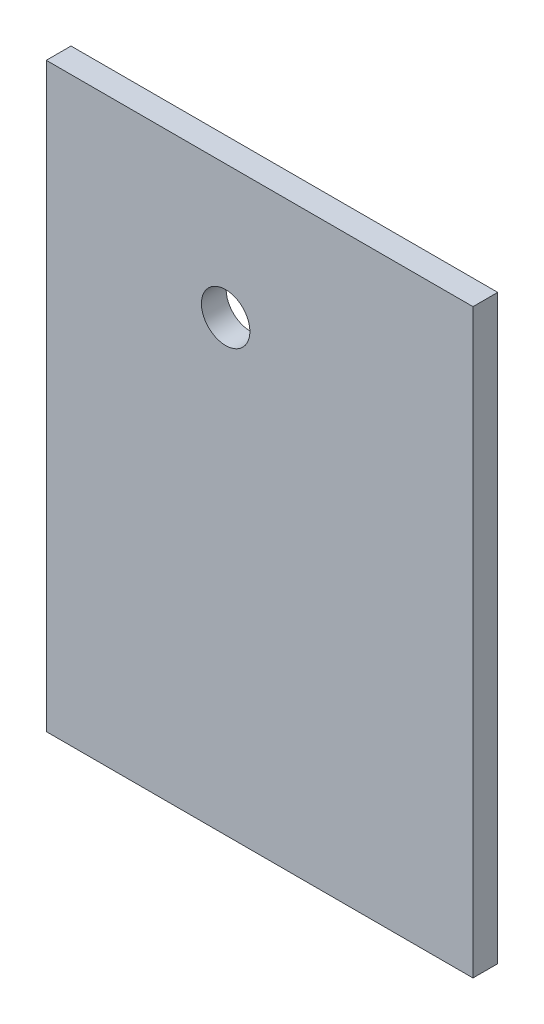
ISO-10303-21;
HEADER;
FILE_DESCRIPTION(('STEP AP214'),'2;1');
FILE_NAME('part.step','',(''),(''),'','','');
FILE_SCHEMA(('AUTOMOTIVE_DESIGN { 1 0 10303 214 1 1 1 1 }'));
ENDSEC;
DATA;
#1=APPLICATION_CONTEXT('core data for automotive mechanical design processes');
#2=APPLICATION_PROTOCOL_DEFINITION('international standard','automotive_design',2000,#1);
#3=PRODUCT_CONTEXT('',#1,'mechanical');
#4=PRODUCT('Part','Part','',(#3));
#5=PRODUCT_RELATED_PRODUCT_CATEGORY('part','',(#4));
#6=PRODUCT_DEFINITION_FORMATION('','',#4);
#7=PRODUCT_DEFINITION_CONTEXT('part definition',#1,'design');
#8=PRODUCT_DEFINITION('design','',#6,#7);
#9=PRODUCT_DEFINITION_SHAPE('','',#8);
#10=(LENGTH_UNIT() NAMED_UNIT(*) SI_UNIT(.MILLI.,.METRE.));
#11=(NAMED_UNIT(*) PLANE_ANGLE_UNIT() SI_UNIT($,.RADIAN.));
#12=(NAMED_UNIT(*) SI_UNIT($,.STERADIAN.) SOLID_ANGLE_UNIT());
#13=UNCERTAINTY_MEASURE_WITH_UNIT(LENGTH_MEASURE(1.E-05),#10,'distance_accuracy_value','');
#14=(GEOMETRIC_REPRESENTATION_CONTEXT(3) GLOBAL_UNCERTAINTY_ASSIGNED_CONTEXT((#13)) GLOBAL_UNIT_ASSIGNED_CONTEXT((#10,
#11,#12)) REPRESENTATION_CONTEXT('',''));
#15=CARTESIAN_POINT('',(0.,0.,0.));
#16=DIRECTION('',(0.,0.,1.));
#17=DIRECTION('',(1.,0.,0.));
#18=AXIS2_PLACEMENT_3D('',#15,#16,#17);
#19=CARTESIAN_POINT('',(0.,0.,2.54));
#20=DIRECTION('',(0.,0.,-1.));
#21=DIRECTION('',(-1.,0.,0.));
#22=AXIS2_PLACEMENT_3D('',#19,#20,#21);
#23=PLANE('',#22);
#24=DIRECTION('',(0.,-1.,0.));
#25=VECTOR('',#24,1.);
#26=CARTESIAN_POINT('',(95.8806209550243,98.4885,2.54));
#27=LINE('',#26,#25);
#28=CARTESIAN_POINT('',(95.8806209550243,158.196337730134,2.54));
#29=VERTEX_POINT('',#28);
#30=CARTESIAN_POINT('',(95.8806209550243,98.4885,2.54));
#31=VERTEX_POINT('',#30);
#32=EDGE_CURVE('E95',#29,#31,#27,.T.);
#33=ORIENTED_EDGE('',*,*,#32,.T.);
#34=DIRECTION('',(1.,0.,0.));
#35=VECTOR('',#34,1.);
#36=CARTESIAN_POINT('',(95.8806209550243,98.4885,2.54));
#37=LINE('',#36,#35);
#38=CARTESIAN_POINT('',(139.7,98.4885,2.54));
#39=VERTEX_POINT('',#38);
#40=EDGE_CURVE('E90',#31,#39,#37,.T.);
#41=ORIENTED_EDGE('',*,*,#40,.T.);
#42=DIRECTION('',(0.,1.,0.));
#43=VECTOR('',#42,1.);
#44=CARTESIAN_POINT('',(139.7,98.4885,2.54));
#45=LINE('',#44,#43);
#46=CARTESIAN_POINT('',(139.7,158.196337730134,2.54));
#47=VERTEX_POINT('',#46);
#48=EDGE_CURVE('E93',#39,#47,#45,.T.);
#49=ORIENTED_EDGE('',*,*,#48,.T.);
#50=DIRECTION('',(-1.,0.,0.));
#51=VECTOR('',#50,1.);
#52=CARTESIAN_POINT('',(95.8806209550243,158.196337730134,2.54));
#53=LINE('',#52,#51);
#54=EDGE_CURVE('E60',#47,#29,#53,.T.);
#55=ORIENTED_EDGE('',*,*,#54,.T.);
#56=EDGE_LOOP('',(#33,#41,#49,#55));
#57=FACE_BOUND('',#56,.T.);
#58=CARTESIAN_POINT('',(114.3,144.526,2.54));
#59=DIRECTION('',(0.,0.,1.));
#60=DIRECTION('',(1.,0.,0.));
#61=AXIS2_PLACEMENT_3D('',#58,#59,#60);
#62=CIRCLE('',#61,2.48920000000003);
#63=CARTESIAN_POINT('',(116.7892,144.526,2.54));
#64=VERTEX_POINT('',#63);
#65=EDGE_CURVE('E110',#64,#64,#62,.T.);
#66=ORIENTED_EDGE('',*,*,#65,.F.);
#67=EDGE_LOOP('',(#66));
#68=FACE_BOUND('',#67,.T.);
#69=ADVANCED_FACE('F43',(#57,#68),#23,.F.);
#70=CARTESIAN_POINT('',(0.,0.,0.));
#71=DIRECTION('',(0.,0.,-1.));
#72=DIRECTION('',(-1.,0.,0.));
#73=AXIS2_PLACEMENT_3D('',#70,#71,#72);
#74=PLANE('',#73);
#75=DIRECTION('',(0.,-1.,0.));
#76=VECTOR('',#75,1.);
#77=CARTESIAN_POINT('',(95.8806209550243,98.4885,0.));
#78=LINE('',#77,#76);
#79=CARTESIAN_POINT('',(95.8806209550243,158.196337730134,0.));
#80=VERTEX_POINT('',#79);
#81=CARTESIAN_POINT('',(95.8806209550243,98.4885,0.));
#82=VERTEX_POINT('',#81);
#83=EDGE_CURVE('E107',#80,#82,#78,.T.);
#84=ORIENTED_EDGE('',*,*,#83,.F.);
#85=DIRECTION('',(-1.,0.,0.));
#86=VECTOR('',#85,1.);
#87=CARTESIAN_POINT('',(95.8806209550243,158.196337730134,0.));
#88=LINE('',#87,#86);
#89=CARTESIAN_POINT('',(139.7,158.196337730134,0.));
#90=VERTEX_POINT('',#89);
#91=EDGE_CURVE('E83',#90,#80,#88,.T.);
#92=ORIENTED_EDGE('',*,*,#91,.F.);
#93=DIRECTION('',(0.,1.,0.));
#94=VECTOR('',#93,1.);
#95=CARTESIAN_POINT('',(139.7,98.4885,0.));
#96=LINE('',#95,#94);
#97=CARTESIAN_POINT('',(139.7,98.4885,0.));
#98=VERTEX_POINT('',#97);
#99=EDGE_CURVE('E77',#98,#90,#96,.T.);
#100=ORIENTED_EDGE('',*,*,#99,.F.);
#101=DIRECTION('',(1.,0.,0.));
#102=VECTOR('',#101,1.);
#103=CARTESIAN_POINT('',(95.8806209550243,98.4885,0.));
#104=LINE('',#103,#102);
#105=EDGE_CURVE('E99',#82,#98,#104,.T.);
#106=ORIENTED_EDGE('',*,*,#105,.F.);
#107=EDGE_LOOP('',(#84,#92,#100,#106));
#108=FACE_BOUND('',#107,.T.);
#109=CARTESIAN_POINT('',(114.3,144.526,0.));
#110=DIRECTION('',(0.,0.,1.));
#111=DIRECTION('',(1.,0.,0.));
#112=AXIS2_PLACEMENT_3D('',#109,#110,#111);
#113=CIRCLE('',#112,2.48920000000003);
#114=CARTESIAN_POINT('',(116.7892,144.526,0.));
#115=VERTEX_POINT('',#114);
#116=EDGE_CURVE('E122',#115,#115,#113,.T.);
#117=ORIENTED_EDGE('',*,*,#116,.T.);
#118=EDGE_LOOP('',(#117));
#119=FACE_BOUND('',#118,.T.);
#120=ADVANCED_FACE('F118',(#108,#119),#74,.T.);
#121=CARTESIAN_POINT('',(95.8806209550243,98.4885,2.54));
#122=DIRECTION('',(1.,0.,0.));
#123=DIRECTION('',(0.,0.,-1.));
#124=AXIS2_PLACEMENT_3D('',#121,#122,#123);
#125=PLANE('',#124);
#126=ORIENTED_EDGE('',*,*,#83,.T.);
#127=DIRECTION('',(0.,0.,-1.));
#128=VECTOR('',#127,1.);
#129=CARTESIAN_POINT('',(95.8806209550243,98.4885,2.54));
#130=LINE('',#129,#128);
#131=EDGE_CURVE('E11',#31,#82,#130,.T.);
#132=ORIENTED_EDGE('',*,*,#131,.F.);
#133=ORIENTED_EDGE('',*,*,#32,.F.);
#134=DIRECTION('',(0.,0.,-1.));
#135=VECTOR('',#134,1.);
#136=CARTESIAN_POINT('',(95.8806209550243,158.196337730134,2.54));
#137=LINE('',#136,#135);
#138=EDGE_CURVE('E103',#29,#80,#137,.T.);
#139=ORIENTED_EDGE('',*,*,#138,.T.);
#140=EDGE_LOOP('',(#126,#132,#133,#139));
#141=FACE_BOUND('',#140,.T.);
#142=ADVANCED_FACE('F45',(#141),#125,.F.);
#143=CARTESIAN_POINT('',(95.8806209550243,98.4885,2.54));
#144=DIRECTION('',(0.,1.,0.));
#145=DIRECTION('',(0.,0.,1.));
#146=AXIS2_PLACEMENT_3D('',#143,#144,#145);
#147=PLANE('',#146);
#148=ORIENTED_EDGE('',*,*,#105,.T.);
#149=DIRECTION('',(0.,0.,-1.));
#150=VECTOR('',#149,1.);
#151=CARTESIAN_POINT('',(139.7,98.4885,2.54));
#152=LINE('',#151,#150);
#153=EDGE_CURVE('E52',#39,#98,#152,.T.);
#154=ORIENTED_EDGE('',*,*,#153,.F.);
#155=ORIENTED_EDGE('',*,*,#40,.F.);
#156=ORIENTED_EDGE('',*,*,#131,.T.);
#157=EDGE_LOOP('',(#148,#154,#155,#156));
#158=FACE_BOUND('',#157,.T.);
#159=ADVANCED_FACE('F98',(#158),#147,.F.);
#160=CARTESIAN_POINT('',(139.7,98.4885,2.54));
#161=DIRECTION('',(-1.,0.,0.));
#162=DIRECTION('',(0.,0.,1.));
#163=AXIS2_PLACEMENT_3D('',#160,#161,#162);
#164=PLANE('',#163);
#165=ORIENTED_EDGE('',*,*,#99,.T.);
#166=DIRECTION('',(0.,0.,-1.));
#167=VECTOR('',#166,1.);
#168=CARTESIAN_POINT('',(139.7,158.196337730134,2.54));
#169=LINE('',#168,#167);
#170=EDGE_CURVE('E100',#47,#90,#169,.T.);
#171=ORIENTED_EDGE('',*,*,#170,.F.);
#172=ORIENTED_EDGE('',*,*,#48,.F.);
#173=ORIENTED_EDGE('',*,*,#153,.T.);
#174=EDGE_LOOP('',(#165,#171,#172,#173));
#175=FACE_BOUND('',#174,.T.);
#176=ADVANCED_FACE('F101',(#175),#164,.F.);
#177=CARTESIAN_POINT('',(95.8806209550243,158.196337730134,2.54));
#178=DIRECTION('',(0.,-1.,0.));
#179=DIRECTION('',(0.,0.,-1.));
#180=AXIS2_PLACEMENT_3D('',#177,#178,#179);
#181=PLANE('',#180);
#182=ORIENTED_EDGE('',*,*,#91,.T.);
#183=ORIENTED_EDGE('',*,*,#138,.F.);
#184=ORIENTED_EDGE('',*,*,#54,.F.);
#185=ORIENTED_EDGE('',*,*,#170,.T.);
#186=EDGE_LOOP('',(#182,#183,#184,#185));
#187=FACE_BOUND('',#186,.T.);
#188=ADVANCED_FACE('F115',(#187),#181,.F.);
#189=CARTESIAN_POINT('',(114.3,144.526,2.54));
#190=DIRECTION('',(0.,0.,-1.));
#191=DIRECTION('',(-1.,0.,0.));
#192=AXIS2_PLACEMENT_3D('',#189,#190,#191);
#193=CYLINDRICAL_SURFACE('',#192,2.48920000000003);
#194=ORIENTED_EDGE('',*,*,#65,.T.);
#195=EDGE_LOOP('',(#194));
#196=FACE_BOUND('',#195,.T.);
#197=ORIENTED_EDGE('',*,*,#116,.F.);
#198=EDGE_LOOP('',(#197));
#199=FACE_BOUND('',#198,.T.);
#200=ADVANCED_FACE('F128',(#196,#199),#193,.F.);
#201=CLOSED_SHELL('',(#69,#120,#142,#159,#176,#188,#200));
#202=MANIFOLD_SOLID_BREP('B2',#201);
#203=ADVANCED_BREP_SHAPE_REPRESENTATION('',(#18,#202),#14);
#204=SHAPE_DEFINITION_REPRESENTATION(#9,#203);
ENDSEC;
END-ISO-10303-21;
